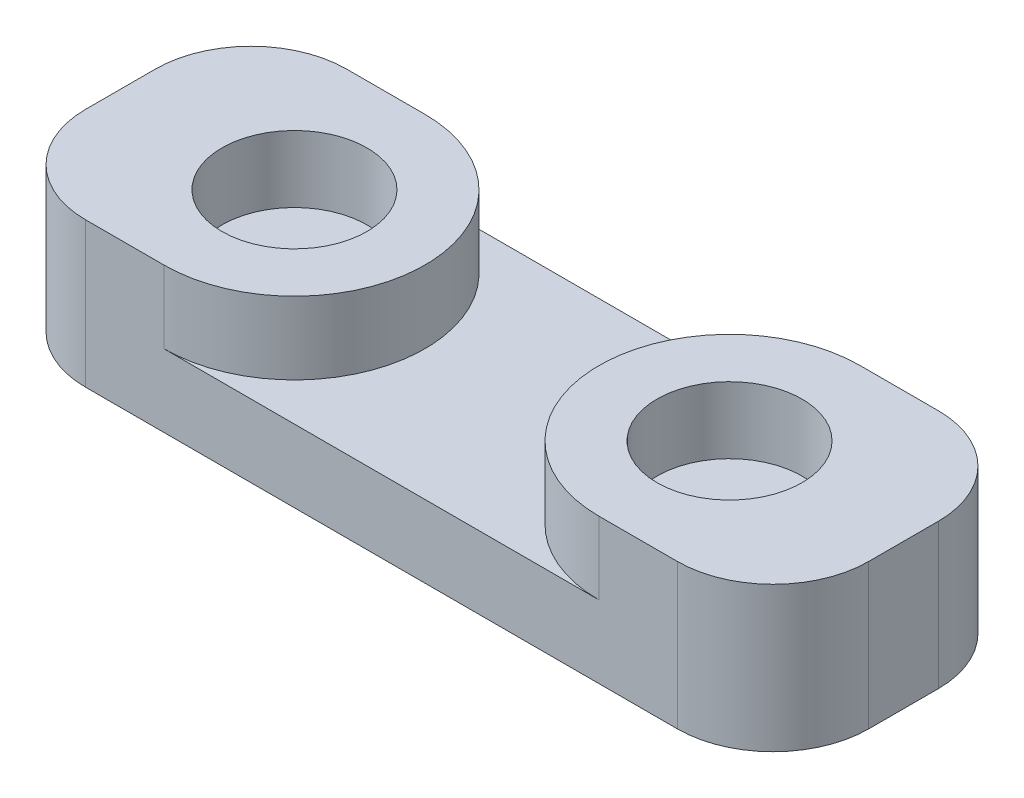
ISO-10303-21;
HEADER;
FILE_DESCRIPTION(('STEP AP214'),'2;1');
FILE_NAME('part.step','',(''),(''),'','','');
FILE_SCHEMA(('AUTOMOTIVE_DESIGN { 1 0 10303 214 1 1 1 1 }'));
ENDSEC;
DATA;
#1=APPLICATION_CONTEXT('core data for automotive mechanical design processes');
#2=APPLICATION_PROTOCOL_DEFINITION('international standard','automotive_design',2000,#1);
#3=PRODUCT_CONTEXT('',#1,'mechanical');
#4=PRODUCT('Part','Part','',(#3));
#5=PRODUCT_RELATED_PRODUCT_CATEGORY('part','',(#4));
#6=PRODUCT_DEFINITION_FORMATION('','',#4);
#7=PRODUCT_DEFINITION_CONTEXT('part definition',#1,'design');
#8=PRODUCT_DEFINITION('design','',#6,#7);
#9=PRODUCT_DEFINITION_SHAPE('','',#8);
#10=(LENGTH_UNIT() NAMED_UNIT(*) SI_UNIT(.MILLI.,.METRE.));
#11=(NAMED_UNIT(*) PLANE_ANGLE_UNIT() SI_UNIT($,.RADIAN.));
#12=(NAMED_UNIT(*) SI_UNIT($,.STERADIAN.) SOLID_ANGLE_UNIT());
#13=UNCERTAINTY_MEASURE_WITH_UNIT(LENGTH_MEASURE(1.E-05),#10,'distance_accuracy_value','');
#14=(GEOMETRIC_REPRESENTATION_CONTEXT(3) GLOBAL_UNCERTAINTY_ASSIGNED_CONTEXT((#13)) GLOBAL_UNIT_ASSIGNED_CONTEXT((#10,
#11,#12)) REPRESENTATION_CONTEXT('',''));
#15=CARTESIAN_POINT('',(0.,0.,0.));
#16=DIRECTION('',(0.,0.,1.));
#17=DIRECTION('',(1.,0.,0.));
#18=AXIS2_PLACEMENT_3D('',#15,#16,#17);
#19=CARTESIAN_POINT('',(-13.5,5.,4.5));
#20=DIRECTION('',(0.,0.,-1.));
#21=DIRECTION('',(-1.,0.,0.));
#22=AXIS2_PLACEMENT_3D('',#19,#20,#21);
#23=PLANE('',#22);
#24=DIRECTION('',(0.,1.,0.));
#25=VECTOR('',#24,1.);
#26=CARTESIAN_POINT('',(7.5,2.5,4.5));
#27=LINE('',#26,#25);
#28=CARTESIAN_POINT('',(7.5,2.5,4.5));
#29=VERTEX_POINT('',#28);
#30=CARTESIAN_POINT('',(7.5,5.,4.5));
#31=VERTEX_POINT('',#30);
#32=EDGE_CURVE('E152',#29,#31,#27,.T.);
#33=ORIENTED_EDGE('',*,*,#32,.F.);
#34=DIRECTION('',(1.,0.,0.));
#35=VECTOR('',#34,1.);
#36=CARTESIAN_POINT('',(0.,2.5,4.5));
#37=LINE('',#36,#35);
#38=CARTESIAN_POINT('',(-7.5,2.5,4.5));
#39=VERTEX_POINT('',#38);
#40=EDGE_CURVE('E132',#39,#29,#37,.T.);
#41=ORIENTED_EDGE('',*,*,#40,.F.);
#42=DIRECTION('',(0.,1.,0.));
#43=VECTOR('',#42,1.);
#44=CARTESIAN_POINT('',(-7.5,2.5,4.5));
#45=LINE('',#44,#43);
#46=CARTESIAN_POINT('',(-7.5,5.,4.5));
#47=VERTEX_POINT('',#46);
#48=EDGE_CURVE('E155',#39,#47,#45,.T.);
#49=ORIENTED_EDGE('',*,*,#48,.T.);
#50=DIRECTION('',(1.,0.,0.));
#51=VECTOR('',#50,1.);
#52=CARTESIAN_POINT('',(-13.5,5.,4.5));
#53=LINE('',#52,#51);
#54=CARTESIAN_POINT('',(-10.2,5.,4.5));
#55=VERTEX_POINT('',#54);
#56=EDGE_CURVE('E181',#55,#47,#53,.T.);
#57=ORIENTED_EDGE('',*,*,#56,.F.);
#58=DIRECTION('',(0.,-1.,0.));
#59=VECTOR('',#58,1.);
#60=CARTESIAN_POINT('',(-10.2,5.,4.5));
#61=LINE('',#60,#59);
#62=CARTESIAN_POINT('',(-10.2,0.,4.5));
#63=VERTEX_POINT('',#62);
#64=EDGE_CURVE('E223',#55,#63,#61,.T.);
#65=ORIENTED_EDGE('',*,*,#64,.T.);
#66=DIRECTION('',(1.,0.,0.));
#67=VECTOR('',#66,1.);
#68=CARTESIAN_POINT('',(-13.5,0.,4.5));
#69=LINE('',#68,#67);
#70=CARTESIAN_POINT('',(10.2,0.,4.5));
#71=VERTEX_POINT('',#70);
#72=EDGE_CURVE('E175',#63,#71,#69,.T.);
#73=ORIENTED_EDGE('',*,*,#72,.T.);
#74=DIRECTION('',(0.,-1.,0.));
#75=VECTOR('',#74,1.);
#76=CARTESIAN_POINT('',(10.2,5.,4.5));
#77=LINE('',#76,#75);
#78=CARTESIAN_POINT('',(10.2,5.,4.5));
#79=VERTEX_POINT('',#78);
#80=EDGE_CURVE('E221',#71,#79,#77,.F.);
#81=ORIENTED_EDGE('',*,*,#80,.T.);
#82=EDGE_CURVE('E56',#31,#79,#53,.T.);
#83=ORIENTED_EDGE('',*,*,#82,.F.);
#84=EDGE_LOOP('',(#33,#41,#49,#57,#65,#73,#81,#83));
#85=FACE_BOUND('',#84,.T.);
#86=ADVANCED_FACE('F33',(#85),#23,.F.);
#87=CARTESIAN_POINT('',(0.,5.,0.));
#88=DIRECTION('',(0.,1.,0.));
#89=DIRECTION('',(0.,0.,1.));
#90=AXIS2_PLACEMENT_3D('',#87,#88,#89);
#91=PLANE('',#90);
#92=CARTESIAN_POINT('',(7.5,5.,0.));
#93=DIRECTION('',(0.,1.,0.));
#94=DIRECTION('',(0.,0.,1.));
#95=AXIS2_PLACEMENT_3D('',#92,#93,#94);
#96=CIRCLE('',#95,2.5);
#97=CARTESIAN_POINT('',(7.5,5.,2.5));
#98=VERTEX_POINT('',#97);
#99=EDGE_CURVE('E154',#98,#98,#96,.T.);
#100=ORIENTED_EDGE('',*,*,#99,.F.);
#101=EDGE_LOOP('',(#100));
#102=FACE_BOUND('',#101,.T.);
#103=DIRECTION('',(-1.,0.,0.));
#104=VECTOR('',#103,1.);
#105=CARTESIAN_POINT('',(-13.5,5.,-4.5));
#106=LINE('',#105,#104);
#107=CARTESIAN_POINT('',(10.2,5.,-4.5));
#108=VERTEX_POINT('',#107);
#109=CARTESIAN_POINT('',(7.5,5.,-4.5));
#110=VERTEX_POINT('',#109);
#111=EDGE_CURVE('E176',#108,#110,#106,.T.);
#112=ORIENTED_EDGE('',*,*,#111,.T.);
#113=CARTESIAN_POINT('',(7.5,5.,0.));
#114=DIRECTION('',(0.,1.,0.));
#115=DIRECTION('',(0.,0.,1.));
#116=AXIS2_PLACEMENT_3D('',#113,#114,#115);
#117=CIRCLE('',#116,4.5);
#118=EDGE_CURVE('E127',#110,#31,#117,.T.);
#119=ORIENTED_EDGE('',*,*,#118,.T.);
#120=ORIENTED_EDGE('',*,*,#82,.T.);
#121=CARTESIAN_POINT('',(10.2,5.,1.2));
#122=DIRECTION('',(0.,1.,0.));
#123=DIRECTION('',(0.,0.,1.));
#124=AXIS2_PLACEMENT_3D('',#121,#122,#123);
#125=CIRCLE('',#124,3.3);
#126=CARTESIAN_POINT('',(13.5,5.,1.2));
#127=VERTEX_POINT('',#126);
#128=EDGE_CURVE('E215',#79,#127,#125,.T.);
#129=ORIENTED_EDGE('',*,*,#128,.T.);
#130=DIRECTION('',(0.,0.,-1.));
#131=VECTOR('',#130,1.);
#132=CARTESIAN_POINT('',(13.5,5.,-4.5));
#133=LINE('',#132,#131);
#134=CARTESIAN_POINT('',(13.5,5.,-1.2));
#135=VERTEX_POINT('',#134);
#136=EDGE_CURVE('E171',#127,#135,#133,.T.);
#137=ORIENTED_EDGE('',*,*,#136,.T.);
#138=CARTESIAN_POINT('',(10.2,5.,-1.2));
#139=DIRECTION('',(0.,1.,0.));
#140=DIRECTION('',(0.,0.,1.));
#141=AXIS2_PLACEMENT_3D('',#138,#139,#140);
#142=CIRCLE('',#141,3.3);
#143=EDGE_CURVE('E213',#135,#108,#142,.T.);
#144=ORIENTED_EDGE('',*,*,#143,.T.);
#145=EDGE_LOOP('',(#112,#119,#120,#129,#137,#144));
#146=FACE_BOUND('',#145,.T.);
#147=ADVANCED_FACE('F233',(#102,#146),#91,.T.);
#148=CARTESIAN_POINT('',(-7.5,5.,0.));
#149=DIRECTION('',(0.,1.,0.));
#150=DIRECTION('',(0.,0.,1.));
#151=AXIS2_PLACEMENT_3D('',#148,#149,#150);
#152=CIRCLE('',#151,2.5);
#153=CARTESIAN_POINT('',(-7.5,5.,2.5));
#154=VERTEX_POINT('',#153);
#155=EDGE_CURVE('E163',#154,#154,#152,.T.);
#156=ORIENTED_EDGE('',*,*,#155,.F.);
#157=EDGE_LOOP('',(#156));
#158=FACE_BOUND('',#157,.T.);
#159=ORIENTED_EDGE('',*,*,#56,.T.);
#160=CARTESIAN_POINT('',(-7.5,5.,0.));
#161=DIRECTION('',(0.,1.,0.));
#162=DIRECTION('',(0.,0.,1.));
#163=AXIS2_PLACEMENT_3D('',#160,#161,#162);
#164=CIRCLE('',#163,4.5);
#165=CARTESIAN_POINT('',(-7.5,5.,-4.5));
#166=VERTEX_POINT('',#165);
#167=EDGE_CURVE('E141',#47,#166,#164,.T.);
#168=ORIENTED_EDGE('',*,*,#167,.T.);
#169=CARTESIAN_POINT('',(-10.2,5.,-4.5));
#170=VERTEX_POINT('',#169);
#171=EDGE_CURVE('E174',#166,#170,#106,.T.);
#172=ORIENTED_EDGE('',*,*,#171,.T.);
#173=CARTESIAN_POINT('',(-10.2,5.,-1.2));
#174=DIRECTION('',(0.,1.,0.));
#175=DIRECTION('',(0.,0.,1.));
#176=AXIS2_PLACEMENT_3D('',#173,#174,#175);
#177=CIRCLE('',#176,3.3);
#178=CARTESIAN_POINT('',(-13.5,5.,-1.2));
#179=VERTEX_POINT('',#178);
#180=EDGE_CURVE('E219',#170,#179,#177,.T.);
#181=ORIENTED_EDGE('',*,*,#180,.T.);
#182=DIRECTION('',(0.,0.,1.));
#183=VECTOR('',#182,1.);
#184=CARTESIAN_POINT('',(-13.5,5.,-4.5));
#185=LINE('',#184,#183);
#186=CARTESIAN_POINT('',(-13.5,5.,1.2));
#187=VERTEX_POINT('',#186);
#188=EDGE_CURVE('E178',#179,#187,#185,.T.);
#189=ORIENTED_EDGE('',*,*,#188,.T.);
#190=CARTESIAN_POINT('',(-10.2,5.,1.2));
#191=DIRECTION('',(0.,1.,0.));
#192=DIRECTION('',(0.,0.,1.));
#193=AXIS2_PLACEMENT_3D('',#190,#191,#192);
#194=CIRCLE('',#193,3.3);
#195=EDGE_CURVE('E217',#187,#55,#194,.T.);
#196=ORIENTED_EDGE('',*,*,#195,.T.);
#197=EDGE_LOOP('',(#159,#168,#172,#181,#189,#196));
#198=FACE_BOUND('',#197,.T.);
#199=ADVANCED_FACE('F251',(#158,#198),#91,.T.);
#200=CARTESIAN_POINT('',(13.5,5.,-4.5));
#201=DIRECTION('',(-1.,0.,0.));
#202=DIRECTION('',(0.,0.,1.));
#203=AXIS2_PLACEMENT_3D('',#200,#201,#202);
#204=PLANE('',#203);
#205=ORIENTED_EDGE('',*,*,#136,.F.);
#206=DIRECTION('',(0.,-1.,0.));
#207=VECTOR('',#206,1.);
#208=CARTESIAN_POINT('',(13.5,5.,1.2));
#209=LINE('',#208,#207);
#210=CARTESIAN_POINT('',(13.5,0.,1.2));
#211=VERTEX_POINT('',#210);
#212=EDGE_CURVE('E11',#127,#211,#209,.T.);
#213=ORIENTED_EDGE('',*,*,#212,.T.);
#214=DIRECTION('',(0.,0.,-1.));
#215=VECTOR('',#214,1.);
#216=CARTESIAN_POINT('',(13.5,0.,-4.5));
#217=LINE('',#216,#215);
#218=CARTESIAN_POINT('',(13.5,0.,-1.2));
#219=VERTEX_POINT('',#218);
#220=EDGE_CURVE('E162',#211,#219,#217,.T.);
#221=ORIENTED_EDGE('',*,*,#220,.T.);
#222=DIRECTION('',(0.,-1.,0.));
#223=VECTOR('',#222,1.);
#224=CARTESIAN_POINT('',(13.5,5.,-1.2));
#225=LINE('',#224,#223);
#226=EDGE_CURVE('E41',#219,#135,#225,.F.);
#227=ORIENTED_EDGE('',*,*,#226,.T.);
#228=EDGE_LOOP('',(#205,#213,#221,#227));
#229=FACE_BOUND('',#228,.T.);
#230=ADVANCED_FACE('F228',(#229),#204,.F.);
#231=CARTESIAN_POINT('',(-13.5,5.,-4.5));
#232=DIRECTION('',(0.,0.,1.));
#233=DIRECTION('',(1.,0.,0.));
#234=AXIS2_PLACEMENT_3D('',#231,#232,#233);
#235=PLANE('',#234);
#236=DIRECTION('',(-1.,0.,0.));
#237=VECTOR('',#236,1.);
#238=CARTESIAN_POINT('',(0.,2.5,-4.5));
#239=LINE('',#238,#237);
#240=CARTESIAN_POINT('',(7.5,2.5,-4.5));
#241=VERTEX_POINT('',#240);
#242=CARTESIAN_POINT('',(-7.5,2.5,-4.5));
#243=VERTEX_POINT('',#242);
#244=EDGE_CURVE('E138',#241,#243,#239,.T.);
#245=ORIENTED_EDGE('',*,*,#244,.F.);
#246=DIRECTION('',(0.,1.,0.));
#247=VECTOR('',#246,1.);
#248=CARTESIAN_POINT('',(7.5,2.5,-4.5));
#249=LINE('',#248,#247);
#250=EDGE_CURVE('E122',#241,#110,#249,.T.);
#251=ORIENTED_EDGE('',*,*,#250,.T.);
#252=ORIENTED_EDGE('',*,*,#111,.F.);
#253=DIRECTION('',(0.,-1.,0.));
#254=VECTOR('',#253,1.);
#255=CARTESIAN_POINT('',(10.2,5.,-4.5));
#256=LINE('',#255,#254);
#257=CARTESIAN_POINT('',(10.2,0.,-4.5));
#258=VERTEX_POINT('',#257);
#259=EDGE_CURVE('E207',#108,#258,#256,.T.);
#260=ORIENTED_EDGE('',*,*,#259,.T.);
#261=DIRECTION('',(-1.,0.,0.));
#262=VECTOR('',#261,1.);
#263=CARTESIAN_POINT('',(-13.5,0.,-4.5));
#264=LINE('',#263,#262);
#265=CARTESIAN_POINT('',(-10.2,0.,-4.5));
#266=VERTEX_POINT('',#265);
#267=EDGE_CURVE('E187',#258,#266,#264,.T.);
#268=ORIENTED_EDGE('',*,*,#267,.T.);
#269=DIRECTION('',(0.,-1.,0.));
#270=VECTOR('',#269,1.);
#271=CARTESIAN_POINT('',(-10.2,5.,-4.5));
#272=LINE('',#271,#270);
#273=EDGE_CURVE('E210',#266,#170,#272,.F.);
#274=ORIENTED_EDGE('',*,*,#273,.T.);
#275=ORIENTED_EDGE('',*,*,#171,.F.);
#276=DIRECTION('',(0.,1.,0.));
#277=VECTOR('',#276,1.);
#278=CARTESIAN_POINT('',(-7.5,2.5,-4.5));
#279=LINE('',#278,#277);
#280=EDGE_CURVE('E48',#243,#166,#279,.T.);
#281=ORIENTED_EDGE('',*,*,#280,.F.);
#282=EDGE_LOOP('',(#245,#251,#252,#260,#268,#274,#275,#281));
#283=FACE_BOUND('',#282,.T.);
#284=ADVANCED_FACE('F143',(#283),#235,.F.);
#285=CARTESIAN_POINT('',(-13.5,5.,-4.5));
#286=DIRECTION('',(1.,0.,0.));
#287=DIRECTION('',(0.,0.,-1.));
#288=AXIS2_PLACEMENT_3D('',#285,#286,#287);
#289=PLANE('',#288);
#290=ORIENTED_EDGE('',*,*,#188,.F.);
#291=DIRECTION('',(0.,-1.,0.));
#292=VECTOR('',#291,1.);
#293=CARTESIAN_POINT('',(-13.5,5.,-1.2));
#294=LINE('',#293,#292);
#295=CARTESIAN_POINT('',(-13.5,0.,-1.2));
#296=VERTEX_POINT('',#295);
#297=EDGE_CURVE('E196',#179,#296,#294,.T.);
#298=ORIENTED_EDGE('',*,*,#297,.T.);
#299=DIRECTION('',(0.,0.,1.));
#300=VECTOR('',#299,1.);
#301=CARTESIAN_POINT('',(-13.5,0.,-4.5));
#302=LINE('',#301,#300);
#303=CARTESIAN_POINT('',(-13.5,0.,1.2));
#304=VERTEX_POINT('',#303);
#305=EDGE_CURVE('E190',#296,#304,#302,.T.);
#306=ORIENTED_EDGE('',*,*,#305,.T.);
#307=DIRECTION('',(0.,-1.,0.));
#308=VECTOR('',#307,1.);
#309=CARTESIAN_POINT('',(-13.5,5.,1.2));
#310=LINE('',#309,#308);
#311=EDGE_CURVE('E184',#304,#187,#310,.F.);
#312=ORIENTED_EDGE('',*,*,#311,.T.);
#313=EDGE_LOOP('',(#290,#298,#306,#312));
#314=FACE_BOUND('',#313,.T.);
#315=ADVANCED_FACE('F247',(#314),#289,.F.);
#316=CARTESIAN_POINT('',(0.,0.,0.));
#317=DIRECTION('',(0.,1.,0.));
#318=DIRECTION('',(0.,0.,1.));
#319=AXIS2_PLACEMENT_3D('',#316,#317,#318);
#320=PLANE('',#319);
#321=ORIENTED_EDGE('',*,*,#305,.F.);
#322=CARTESIAN_POINT('',(-10.2,0.,-1.2));
#323=DIRECTION('',(0.,1.,0.));
#324=DIRECTION('',(0.,0.,1.));
#325=AXIS2_PLACEMENT_3D('',#322,#323,#324);
#326=CIRCLE('',#325,3.3);
#327=EDGE_CURVE('E205',#296,#266,#326,.F.);
#328=ORIENTED_EDGE('',*,*,#327,.T.);
#329=ORIENTED_EDGE('',*,*,#267,.F.);
#330=CARTESIAN_POINT('',(10.2,0.,-1.2));
#331=DIRECTION('',(0.,1.,0.));
#332=DIRECTION('',(0.,0.,1.));
#333=AXIS2_PLACEMENT_3D('',#330,#331,#332);
#334=CIRCLE('',#333,3.3);
#335=EDGE_CURVE('E199',#258,#219,#334,.F.);
#336=ORIENTED_EDGE('',*,*,#335,.T.);
#337=ORIENTED_EDGE('',*,*,#220,.F.);
#338=CARTESIAN_POINT('',(10.2,0.,1.2));
#339=DIRECTION('',(0.,1.,0.));
#340=DIRECTION('',(0.,0.,1.));
#341=AXIS2_PLACEMENT_3D('',#338,#339,#340);
#342=CIRCLE('',#341,3.3);
#343=EDGE_CURVE('E201',#211,#71,#342,.F.);
#344=ORIENTED_EDGE('',*,*,#343,.T.);
#345=ORIENTED_EDGE('',*,*,#72,.F.);
#346=CARTESIAN_POINT('',(-10.2,0.,1.2));
#347=DIRECTION('',(0.,1.,0.));
#348=DIRECTION('',(0.,0.,1.));
#349=AXIS2_PLACEMENT_3D('',#346,#347,#348);
#350=CIRCLE('',#349,3.3);
#351=EDGE_CURVE('E203',#63,#304,#350,.F.);
#352=ORIENTED_EDGE('',*,*,#351,.T.);
#353=EDGE_LOOP('',(#321,#328,#329,#336,#337,#344,#345,#352));
#354=FACE_BOUND('',#353,.T.);
#355=ADVANCED_FACE('F240',(#354),#320,.F.);
#356=CARTESIAN_POINT('',(-10.2,5.,-1.2));
#357=DIRECTION('',(0.,-1.,0.));
#358=DIRECTION('',(0.,0.,-1.));
#359=AXIS2_PLACEMENT_3D('',#356,#357,#358);
#360=CYLINDRICAL_SURFACE('',#359,3.3);
#361=ORIENTED_EDGE('',*,*,#180,.F.);
#362=ORIENTED_EDGE('',*,*,#273,.F.);
#363=ORIENTED_EDGE('',*,*,#327,.F.);
#364=ORIENTED_EDGE('',*,*,#297,.F.);
#365=EDGE_LOOP('',(#361,#362,#363,#364));
#366=FACE_BOUND('',#365,.T.);
#367=ADVANCED_FACE('F244',(#366),#360,.T.);
#368=CARTESIAN_POINT('',(-10.2,5.,1.2));
#369=DIRECTION('',(0.,-1.,0.));
#370=DIRECTION('',(0.,0.,-1.));
#371=AXIS2_PLACEMENT_3D('',#368,#369,#370);
#372=CYLINDRICAL_SURFACE('',#371,3.3);
#373=ORIENTED_EDGE('',*,*,#195,.F.);
#374=ORIENTED_EDGE('',*,*,#311,.F.);
#375=ORIENTED_EDGE('',*,*,#351,.F.);
#376=ORIENTED_EDGE('',*,*,#64,.F.);
#377=EDGE_LOOP('',(#373,#374,#375,#376));
#378=FACE_BOUND('',#377,.T.);
#379=ADVANCED_FACE('F255',(#378),#372,.T.);
#380=CARTESIAN_POINT('',(10.2,5.,1.2));
#381=DIRECTION('',(0.,-1.,0.));
#382=DIRECTION('',(0.,0.,-1.));
#383=AXIS2_PLACEMENT_3D('',#380,#381,#382);
#384=CYLINDRICAL_SURFACE('',#383,3.3);
#385=ORIENTED_EDGE('',*,*,#128,.F.);
#386=ORIENTED_EDGE('',*,*,#80,.F.);
#387=ORIENTED_EDGE('',*,*,#343,.F.);
#388=ORIENTED_EDGE('',*,*,#212,.F.);
#389=EDGE_LOOP('',(#385,#386,#387,#388));
#390=FACE_BOUND('',#389,.T.);
#391=ADVANCED_FACE('F260',(#390),#384,.T.);
#392=CARTESIAN_POINT('',(10.2,5.,-1.2));
#393=DIRECTION('',(0.,-1.,0.));
#394=DIRECTION('',(0.,0.,-1.));
#395=AXIS2_PLACEMENT_3D('',#392,#393,#394);
#396=CYLINDRICAL_SURFACE('',#395,3.3);
#397=ORIENTED_EDGE('',*,*,#143,.F.);
#398=ORIENTED_EDGE('',*,*,#226,.F.);
#399=ORIENTED_EDGE('',*,*,#335,.F.);
#400=ORIENTED_EDGE('',*,*,#259,.F.);
#401=EDGE_LOOP('',(#397,#398,#399,#400));
#402=FACE_BOUND('',#401,.T.);
#403=ADVANCED_FACE('F35',(#402),#396,.T.);
#404=CARTESIAN_POINT('',(7.5,2.7,0.));
#405=DIRECTION('',(0.,1.,0.));
#406=DIRECTION('',(0.,0.,1.));
#407=AXIS2_PLACEMENT_3D('',#404,#405,#406);
#408=CYLINDRICAL_SURFACE('',#407,2.5);
#409=CARTESIAN_POINT('',(7.5,2.7,0.));
#410=DIRECTION('',(0.,1.,0.));
#411=DIRECTION('',(0.,0.,1.));
#412=AXIS2_PLACEMENT_3D('',#409,#410,#411);
#413=CIRCLE('',#412,2.5);
#414=CARTESIAN_POINT('',(7.5,2.7,2.5));
#415=VERTEX_POINT('',#414);
#416=EDGE_CURVE('E166',#415,#415,#413,.T.);
#417=ORIENTED_EDGE('',*,*,#416,.F.);
#418=EDGE_LOOP('',(#417));
#419=FACE_BOUND('',#418,.T.);
#420=ORIENTED_EDGE('',*,*,#99,.T.);
#421=EDGE_LOOP('',(#420));
#422=FACE_BOUND('',#421,.T.);
#423=ADVANCED_FACE('F294',(#419,#422),#408,.F.);
#424=CARTESIAN_POINT('',(7.5,2.7,0.));
#425=DIRECTION('',(0.,1.,0.));
#426=DIRECTION('',(0.,0.,1.));
#427=AXIS2_PLACEMENT_3D('',#424,#425,#426);
#428=PLANE('',#427);
#429=ORIENTED_EDGE('',*,*,#416,.T.);
#430=EDGE_LOOP('',(#429));
#431=FACE_BOUND('',#430,.T.);
#432=ADVANCED_FACE('F298',(#431),#428,.T.);
#433=CARTESIAN_POINT('',(-7.5,2.7,0.));
#434=DIRECTION('',(0.,1.,0.));
#435=DIRECTION('',(0.,0.,1.));
#436=AXIS2_PLACEMENT_3D('',#433,#434,#435);
#437=CYLINDRICAL_SURFACE('',#436,2.5);
#438=CARTESIAN_POINT('',(-7.5,2.7,0.));
#439=DIRECTION('',(0.,1.,0.));
#440=DIRECTION('',(0.,0.,1.));
#441=AXIS2_PLACEMENT_3D('',#438,#439,#440);
#442=CIRCLE('',#441,2.5);
#443=CARTESIAN_POINT('',(-7.5,2.7,2.5));
#444=VERTEX_POINT('',#443);
#445=EDGE_CURVE('E159',#444,#444,#442,.T.);
#446=ORIENTED_EDGE('',*,*,#445,.F.);
#447=EDGE_LOOP('',(#446));
#448=FACE_BOUND('',#447,.T.);
#449=ORIENTED_EDGE('',*,*,#155,.T.);
#450=EDGE_LOOP('',(#449));
#451=FACE_BOUND('',#450,.T.);
#452=ADVANCED_FACE('F304',(#448,#451),#437,.F.);
#453=CARTESIAN_POINT('',(-7.5,2.7,0.));
#454=DIRECTION('',(0.,1.,0.));
#455=DIRECTION('',(0.,0.,1.));
#456=AXIS2_PLACEMENT_3D('',#453,#454,#455);
#457=PLANE('',#456);
#458=ORIENTED_EDGE('',*,*,#445,.T.);
#459=EDGE_LOOP('',(#458));
#460=FACE_BOUND('',#459,.T.);
#461=ADVANCED_FACE('F269',(#460),#457,.T.);
#462=CARTESIAN_POINT('',(7.5,2.5,0.));
#463=DIRECTION('',(0.,1.,0.));
#464=DIRECTION('',(0.,0.,1.));
#465=AXIS2_PLACEMENT_3D('',#462,#463,#464);
#466=CYLINDRICAL_SURFACE('',#465,4.5);
#467=ORIENTED_EDGE('',*,*,#118,.F.);
#468=ORIENTED_EDGE('',*,*,#250,.F.);
#469=CARTESIAN_POINT('',(7.5,2.5,0.));
#470=DIRECTION('',(0.,1.,0.));
#471=DIRECTION('',(0.,0.,1.));
#472=AXIS2_PLACEMENT_3D('',#469,#470,#471);
#473=CIRCLE('',#472,4.5);
#474=EDGE_CURVE('E125',#241,#29,#473,.T.);
#475=ORIENTED_EDGE('',*,*,#474,.T.);
#476=ORIENTED_EDGE('',*,*,#32,.T.);
#477=EDGE_LOOP('',(#467,#468,#475,#476));
#478=FACE_BOUND('',#477,.T.);
#479=ADVANCED_FACE('F124',(#478),#466,.T.);
#480=CARTESIAN_POINT('',(-7.5,2.5,0.));
#481=DIRECTION('',(0.,1.,0.));
#482=DIRECTION('',(0.,0.,1.));
#483=AXIS2_PLACEMENT_3D('',#480,#481,#482);
#484=CYLINDRICAL_SURFACE('',#483,4.5);
#485=ORIENTED_EDGE('',*,*,#167,.F.);
#486=ORIENTED_EDGE('',*,*,#48,.F.);
#487=CARTESIAN_POINT('',(-7.5,2.5,0.));
#488=DIRECTION('',(0.,1.,0.));
#489=DIRECTION('',(0.,0.,1.));
#490=AXIS2_PLACEMENT_3D('',#487,#488,#489);
#491=CIRCLE('',#490,4.5);
#492=EDGE_CURVE('E145',#39,#243,#491,.T.);
#493=ORIENTED_EDGE('',*,*,#492,.T.);
#494=ORIENTED_EDGE('',*,*,#280,.T.);
#495=EDGE_LOOP('',(#485,#486,#493,#494));
#496=FACE_BOUND('',#495,.T.);
#497=ADVANCED_FACE('F261',(#496),#484,.T.);
#498=CARTESIAN_POINT('',(0.,2.5,0.));
#499=DIRECTION('',(0.,1.,0.));
#500=DIRECTION('',(0.,0.,1.));
#501=AXIS2_PLACEMENT_3D('',#498,#499,#500);
#502=PLANE('',#501);
#503=ORIENTED_EDGE('',*,*,#474,.F.);
#504=ORIENTED_EDGE('',*,*,#244,.T.);
#505=ORIENTED_EDGE('',*,*,#492,.F.);
#506=ORIENTED_EDGE('',*,*,#40,.T.);
#507=EDGE_LOOP('',(#503,#504,#505,#506));
#508=FACE_BOUND('',#507,.T.);
#509=ADVANCED_FACE('F136',(#508),#502,.T.);
#510=CLOSED_SHELL('',(#86,#147,#199,#230,#284,#315,#355,#367,#379,#391,#403,#423,#432,#452,#461,
#479,#497,#509));
#511=MANIFOLD_SOLID_BREP('B2',#510);
#512=ADVANCED_BREP_SHAPE_REPRESENTATION('',(#18,#511),#14);
#513=SHAPE_DEFINITION_REPRESENTATION(#9,#512);
ENDSEC;
END-ISO-10303-21;
